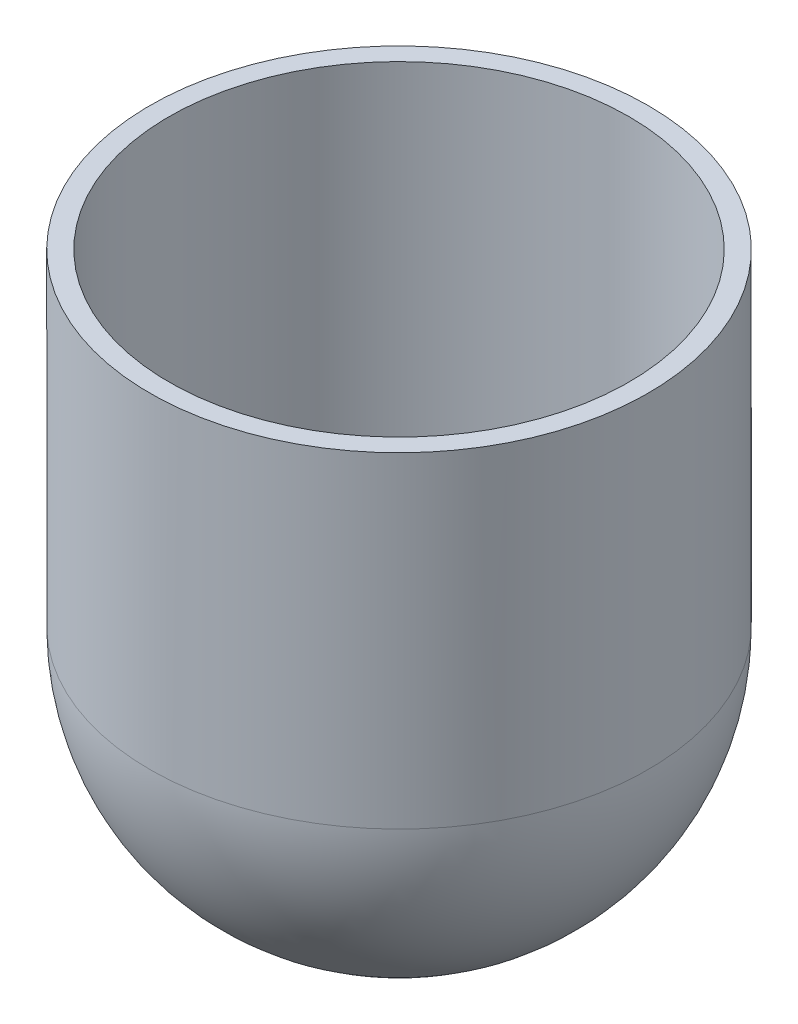
ISO-10303-21;
HEADER;
FILE_DESCRIPTION(('STEP AP214'),'2;1');
FILE_NAME('part.step','',(''),(''),'','','');
FILE_SCHEMA(('AUTOMOTIVE_DESIGN { 1 0 10303 214 1 1 1 1 }'));
ENDSEC;
DATA;
#1=APPLICATION_CONTEXT('core data for automotive mechanical design processes');
#2=APPLICATION_PROTOCOL_DEFINITION('international standard','automotive_design',2000,#1);
#3=PRODUCT_CONTEXT('',#1,'mechanical');
#4=PRODUCT('Part','Part','',(#3));
#5=PRODUCT_RELATED_PRODUCT_CATEGORY('part','',(#4));
#6=PRODUCT_DEFINITION_FORMATION('','',#4);
#7=PRODUCT_DEFINITION_CONTEXT('part definition',#1,'design');
#8=PRODUCT_DEFINITION('design','',#6,#7);
#9=PRODUCT_DEFINITION_SHAPE('','',#8);
#10=(LENGTH_UNIT() NAMED_UNIT(*) SI_UNIT(.MILLI.,.METRE.));
#11=(NAMED_UNIT(*) PLANE_ANGLE_UNIT() SI_UNIT($,.RADIAN.));
#12=(NAMED_UNIT(*) SI_UNIT($,.STERADIAN.) SOLID_ANGLE_UNIT());
#13=UNCERTAINTY_MEASURE_WITH_UNIT(LENGTH_MEASURE(1.E-05),#10,'distance_accuracy_value','');
#14=(GEOMETRIC_REPRESENTATION_CONTEXT(3) GLOBAL_UNCERTAINTY_ASSIGNED_CONTEXT((#13)) GLOBAL_UNIT_ASSIGNED_CONTEXT((#10,
#11,#12)) REPRESENTATION_CONTEXT('',''));
#15=CARTESIAN_POINT('',(0.,0.,0.));
#16=DIRECTION('',(0.,0.,1.));
#17=DIRECTION('',(1.,0.,0.));
#18=AXIS2_PLACEMENT_3D('',#15,#16,#17);
#19=CARTESIAN_POINT('',(0.,32.8043660714183,0.));
#20=DIRECTION('',(0.,-1.,0.));
#21=DIRECTION('',(0.,0.,-1.));
#22=AXIS2_PLACEMENT_3D('',#19,#20,#21);
#23=CYLINDRICAL_SURFACE('',#22,25.4);
#24=CARTESIAN_POINT('',(0.,32.8043660714183,0.));
#25=DIRECTION('',(0.,1.,0.));
#26=DIRECTION('',(0.,0.,1.));
#27=AXIS2_PLACEMENT_3D('',#24,#25,#26);
#28=CIRCLE('',#27,25.4);
#29=CARTESIAN_POINT('',(0.,32.8043660714183,-25.3999999999999));
#30=VERTEX_POINT('',#29);
#31=EDGE_CURVE('E10',#30,#30,#28,.T.);
#32=CARTESIAN_POINT('',(0.,-0.427916672864399,0.));
#33=DIRECTION('',(0.,1.,0.));
#34=DIRECTION('',(-0.391017014129058,0.,-0.920383449797744));
#35=AXIS2_PLACEMENT_3D('',#32,#33,#34);
#36=CIRCLE('',#35,25.4);
#37=CARTESIAN_POINT('',(0.,-0.427916672864577,-25.3999999999999));
#38=VERTEX_POINT('',#37);
#39=EDGE_CURVE('E45',#38,#38,#36,.T.);
#40=CARTESIAN_POINT('',(0.,32.8043660714183,-25.3999999999999));
#41=CARTESIAN_POINT('',(0.,32.4581964594987,-25.3999999999999));
#42=CARTESIAN_POINT('',(0.,32.1120268475791,-25.3999999999999));
#43=CARTESIAN_POINT('',(0.,31.4196876237399,-25.3999999999999));
#44=CARTESIAN_POINT('',(0.,31.0735180118203,-25.3999999999999));
#45=CARTESIAN_POINT('',(0.,30.381178787981,-25.3999999999999));
#46=CARTESIAN_POINT('',(0.,30.0350091760614,-25.3999999999999));
#47=CARTESIAN_POINT('',(0.,29.3426699522222,-25.3999999999999));
#48=CARTESIAN_POINT('',(0.,28.9965003403026,-25.3999999999999));
#49=CARTESIAN_POINT('',(0.,28.3041611164634,-25.3999999999999));
#50=CARTESIAN_POINT('',(0.,27.9579915045437,-25.3999999999999));
#51=CARTESIAN_POINT('',(0.,27.2656522807045,-25.3999999999999));
#52=CARTESIAN_POINT('',(0.,26.9194826687849,-25.3999999999999));
#53=CARTESIAN_POINT('',(0.,26.2271434449457,-25.3999999999999));
#54=CARTESIAN_POINT('',(0.,25.8809738330261,-25.3999999999999));
#55=CARTESIAN_POINT('',(0.,25.1886346091868,-25.3999999999999));
#56=CARTESIAN_POINT('',(0.,24.8424649972672,-25.3999999999999));
#57=CARTESIAN_POINT('',(0.,24.150125773428,-25.3999999999999));
#58=CARTESIAN_POINT('',(0.,23.8039561615084,-25.3999999999999));
#59=CARTESIAN_POINT('',(0.,23.1116169376692,-25.3999999999999));
#60=CARTESIAN_POINT('',(0.,22.7654473257495,-25.3999999999999));
#61=CARTESIAN_POINT('',(0.,22.0731081019103,-25.3999999999999));
#62=CARTESIAN_POINT('',(0.,21.7269384899907,-25.3999999999999));
#63=CARTESIAN_POINT('',(0.,21.0345992661515,-25.3999999999999));
#64=CARTESIAN_POINT('',(0.,20.6884296542319,-25.3999999999999));
#65=CARTESIAN_POINT('',(0.,19.9960904303926,-25.3999999999999));
#66=CARTESIAN_POINT('',(0.,19.649920818473,-25.3999999999999));
#67=CARTESIAN_POINT('',(0.,18.9575815946338,-25.3999999999999));
#68=CARTESIAN_POINT('',(0.,18.6114119827142,-25.3999999999999));
#69=CARTESIAN_POINT('',(0.,17.9190727588749,-25.3999999999999));
#70=CARTESIAN_POINT('',(0.,17.5729031469553,-25.3999999999999));
#71=CARTESIAN_POINT('',(0.,16.8805639231161,-25.3999999999999));
#72=CARTESIAN_POINT('',(0.,16.5343943111965,-25.3999999999999));
#73=CARTESIAN_POINT('',(0.,15.8420550873573,-25.3999999999999));
#74=CARTESIAN_POINT('',(0.,15.4958854754377,-25.3999999999999));
#75=CARTESIAN_POINT('',(0.,14.8035462515984,-25.3999999999999));
#76=CARTESIAN_POINT('',(0.,14.4573766396788,-25.3999999999999));
#77=CARTESIAN_POINT('',(0.,13.7650374158396,-25.3999999999999));
#78=CARTESIAN_POINT('',(0.,13.41886780392,-25.3999999999999));
#79=CARTESIAN_POINT('',(0.,12.7265285800807,-25.3999999999999));
#80=CARTESIAN_POINT('',(0.,12.3803589681611,-25.3999999999999));
#81=CARTESIAN_POINT('',(0.,11.6880197443219,-25.3999999999999));
#82=CARTESIAN_POINT('',(0.,11.3418501324023,-25.3999999999999));
#83=CARTESIAN_POINT('',(0.,10.6495109085631,-25.3999999999999));
#84=CARTESIAN_POINT('',(0.,10.3033412966434,-25.3999999999999));
#85=CARTESIAN_POINT('',(0.,9.61100207280422,-25.3999999999999));
#86=CARTESIAN_POINT('',(0.,9.2648324608846,-25.3999999999999));
#87=CARTESIAN_POINT('',(0.,8.57249323704538,-25.3999999999999));
#88=CARTESIAN_POINT('',(0.,8.22632362512576,-25.3999999999999));
#89=CARTESIAN_POINT('',(0.,7.53398440128653,-25.3999999999999));
#90=CARTESIAN_POINT('',(0.,7.18781478936692,-25.3999999999999));
#91=CARTESIAN_POINT('',(0.,6.49547556552769,-25.3999999999999));
#92=CARTESIAN_POINT('',(0.,6.14930595360808,-25.3999999999999));
#93=CARTESIAN_POINT('',(0.,5.45696672976885,-25.3999999999999));
#94=CARTESIAN_POINT('',(0.,5.11079711784924,-25.3999999999999));
#95=CARTESIAN_POINT('',(0.,4.41845789401001,-25.3999999999999));
#96=CARTESIAN_POINT('',(0.,4.0722882820904,-25.3999999999999));
#97=CARTESIAN_POINT('',(0.,3.37994905825117,-25.3999999999999));
#98=CARTESIAN_POINT('',(0.,3.03377944633155,-25.3999999999999));
#99=CARTESIAN_POINT('',(0.,2.34144022249233,-25.3999999999999));
#100=CARTESIAN_POINT('',(0.,1.99527061057271,-25.3999999999999));
#101=CARTESIAN_POINT('',(0.,1.30293138673349,-25.3999999999999));
#102=CARTESIAN_POINT('',(0.,0.956761774813878,-25.3999999999999));
#103=CARTESIAN_POINT('',(0.,0.264422550974653,-25.3999999999999));
#104=CARTESIAN_POINT('',(0.,-0.0817470609449625,-25.3999999999999));
#105=CARTESIAN_POINT('',(0.,-0.427916672864577,-25.3999999999999));
#106=B_SPLINE_CURVE_WITH_KNOTS('',3,(#40,#41,#42,#43,#44,#45,#46,#47,#48,#49,#50,#51,#52,#53,
#54,#55,#56,#57,#58,#59,#60,#61,#62,#63,#64,#65,#66,#67,#68,#69,#70,#71,#72,#73,#74,#75,#76,#77,
#78,#79,#80,#81,#82,#83,#84,#85,#86,#87,#88,#89,#90,#91,#92,#93,#94,#95,#96,#97,#98,#99,#100,
#101,#102,#103,#104,#105),.UNSPECIFIED.,.F.,.F.,(4,2,2,2,2,2,2,2,2,2,2,2,2,2,2,2,2,2,2,2,2,2,2,
2,2,2,2,2,2,2,2,2,4),(0.,1.03850883575884,2.07701767151769,3.11552650727653,4.15403534303537,
5.19254417879421,6.23105301455305,7.26956185031189,8.30807068607074,9.34657952182957,
10.3850883575884,11.4235971933473,12.4621060291061,13.5006148648649,14.5391237006238,
15.5776325363826,16.6161413721415,17.6546502079003,18.6931590436591,19.731667879418,
20.7701767151768,21.8086855509357,22.8471943866945,23.8857032224534,24.9242120582122,
25.962720893971,27.0012297297299,28.0397385654887,29.0782474012476,30.1167562370064,
31.1552650727652,32.1937739085241,33.2322827442829),.UNSPECIFIED.);
#107=EDGE_CURVE('BSEAM35',#30,#38,#106,.T.);
#108=ORIENTED_EDGE('',*,*,#31,.F.);
#109=ORIENTED_EDGE('',*,*,#39,.T.);
#110=ORIENTED_EDGE('',*,*,#107,.T.);
#111=ORIENTED_EDGE('',*,*,#107,.F.);
#112=EDGE_LOOP('',(#108,#110,#109,#111));
#113=FACE_BOUND('',#112,.T.);
#114=ADVANCED_FACE('F35',(#113),#23,.T.);
#115=CARTESIAN_POINT('',(0.,32.8043660714183,0.));
#116=DIRECTION('',(0.,1.,0.));
#117=DIRECTION('',(0.,0.,1.));
#118=AXIS2_PLACEMENT_3D('',#115,#116,#117);
#119=PLANE('',#118);
#120=CARTESIAN_POINT('',(0.,32.8043660714183,0.));
#121=DIRECTION('',(0.,1.,0.));
#122=DIRECTION('',(0.,0.,1.));
#123=AXIS2_PLACEMENT_3D('',#120,#121,#122);
#124=CIRCLE('',#123,23.4461538461538);
#125=CARTESIAN_POINT('',(0.,32.8043660714183,-23.4461538461538));
#126=VERTEX_POINT('',#125);
#127=EDGE_CURVE('E41',#126,#126,#124,.T.);
#128=ORIENTED_EDGE('',*,*,#127,.F.);
#129=EDGE_LOOP('',(#128));
#130=FACE_BOUND('',#129,.T.);
#131=ORIENTED_EDGE('',*,*,#31,.T.);
#132=EDGE_LOOP('',(#131));
#133=FACE_BOUND('',#132,.T.);
#134=ADVANCED_FACE('F60',(#130,#133),#119,.T.);
#135=CARTESIAN_POINT('',(0.,32.8043660714183,0.));
#136=DIRECTION('',(0.,-1.,0.));
#137=DIRECTION('',(0.,0.,-1.));
#138=AXIS2_PLACEMENT_3D('',#135,#136,#137);
#139=CYLINDRICAL_SURFACE('',#138,23.4461538461538);
#140=CARTESIAN_POINT('',(0.,-0.427916672864564,0.));
#141=DIRECTION('',(0.,-1.,0.));
#142=DIRECTION('',(0.,0.,-1.));
#143=AXIS2_PLACEMENT_3D('',#140,#141,#142);
#144=CIRCLE('',#143,23.4461538461538);
#145=CARTESIAN_POINT('',(0.,-0.427916672864563,-23.4461538461538));
#146=VERTEX_POINT('',#145);
#147=EDGE_CURVE('E49',#146,#146,#144,.F.);
#148=CARTESIAN_POINT('',(0.,32.8043660714183,-23.4461538461538));
#149=CARTESIAN_POINT('',(0.,32.4581964594987,-23.4461538461538));
#150=CARTESIAN_POINT('',(0.,32.1120268475791,-23.4461538461538));
#151=CARTESIAN_POINT('',(0.,31.4196876237399,-23.4461538461538));
#152=CARTESIAN_POINT('',(0.,31.0735180118203,-23.4461538461538));
#153=CARTESIAN_POINT('',(0.,30.381178787981,-23.4461538461538));
#154=CARTESIAN_POINT('',(0.,30.0350091760614,-23.4461538461538));
#155=CARTESIAN_POINT('',(0.,29.3426699522222,-23.4461538461538));
#156=CARTESIAN_POINT('',(0.,28.9965003403026,-23.4461538461538));
#157=CARTESIAN_POINT('',(0.,28.3041611164634,-23.4461538461538));
#158=CARTESIAN_POINT('',(0.,27.9579915045438,-23.4461538461538));
#159=CARTESIAN_POINT('',(0.,27.2656522807045,-23.4461538461538));
#160=CARTESIAN_POINT('',(0.,26.9194826687849,-23.4461538461538));
#161=CARTESIAN_POINT('',(0.,26.2271434449457,-23.4461538461538));
#162=CARTESIAN_POINT('',(0.,25.8809738330261,-23.4461538461538));
#163=CARTESIAN_POINT('',(0.,25.1886346091868,-23.4461538461538));
#164=CARTESIAN_POINT('',(0.,24.8424649972672,-23.4461538461538));
#165=CARTESIAN_POINT('',(0.,24.150125773428,-23.4461538461538));
#166=CARTESIAN_POINT('',(0.,23.8039561615084,-23.4461538461538));
#167=CARTESIAN_POINT('',(0.,23.1116169376692,-23.4461538461538));
#168=CARTESIAN_POINT('',(0.,22.7654473257495,-23.4461538461538));
#169=CARTESIAN_POINT('',(0.,22.0731081019103,-23.4461538461538));
#170=CARTESIAN_POINT('',(0.,21.7269384899907,-23.4461538461538));
#171=CARTESIAN_POINT('',(0.,21.0345992661515,-23.4461538461538));
#172=CARTESIAN_POINT('',(0.,20.6884296542319,-23.4461538461538));
#173=CARTESIAN_POINT('',(0.,19.9960904303926,-23.4461538461538));
#174=CARTESIAN_POINT('',(0.,19.649920818473,-23.4461538461538));
#175=CARTESIAN_POINT('',(0.,18.9575815946338,-23.4461538461538));
#176=CARTESIAN_POINT('',(0.,18.6114119827142,-23.4461538461538));
#177=CARTESIAN_POINT('',(0.,17.919072758875,-23.4461538461538));
#178=CARTESIAN_POINT('',(0.,17.5729031469553,-23.4461538461538));
#179=CARTESIAN_POINT('',(0.,16.8805639231161,-23.4461538461538));
#180=CARTESIAN_POINT('',(0.,16.5343943111965,-23.4461538461538));
#181=CARTESIAN_POINT('',(0.,15.8420550873573,-23.4461538461538));
#182=CARTESIAN_POINT('',(0.,15.4958854754377,-23.4461538461538));
#183=CARTESIAN_POINT('',(0.,14.8035462515984,-23.4461538461538));
#184=CARTESIAN_POINT('',(0.,14.4573766396788,-23.4461538461538));
#185=CARTESIAN_POINT('',(0.,13.7650374158396,-23.4461538461538));
#186=CARTESIAN_POINT('',(0.,13.41886780392,-23.4461538461538));
#187=CARTESIAN_POINT('',(0.,12.7265285800808,-23.4461538461538));
#188=CARTESIAN_POINT('',(0.,12.3803589681611,-23.4461538461538));
#189=CARTESIAN_POINT('',(0.,11.6880197443219,-23.4461538461538));
#190=CARTESIAN_POINT('',(0.,11.3418501324023,-23.4461538461538));
#191=CARTESIAN_POINT('',(0.,10.6495109085631,-23.4461538461538));
#192=CARTESIAN_POINT('',(0.,10.3033412966435,-23.4461538461538));
#193=CARTESIAN_POINT('',(0.,9.61100207280423,-23.4461538461538));
#194=CARTESIAN_POINT('',(0.,9.26483246088462,-23.4461538461538));
#195=CARTESIAN_POINT('',(0.,8.57249323704539,-23.4461538461538));
#196=CARTESIAN_POINT('',(0.,8.22632362512578,-23.4461538461538));
#197=CARTESIAN_POINT('',(0.,7.53398440128655,-23.4461538461538));
#198=CARTESIAN_POINT('',(0.,7.18781478936694,-23.4461538461538));
#199=CARTESIAN_POINT('',(0.,6.49547556552771,-23.4461538461538));
#200=CARTESIAN_POINT('',(0.,6.1493059536081,-23.4461538461538));
#201=CARTESIAN_POINT('',(0.,5.45696672976887,-23.4461538461538));
#202=CARTESIAN_POINT('',(0.,5.11079711784926,-23.4461538461538));
#203=CARTESIAN_POINT('',(0.,4.41845789401003,-23.4461538461538));
#204=CARTESIAN_POINT('',(0.,4.07228828209041,-23.4461538461538));
#205=CARTESIAN_POINT('',(0.,3.37994905825119,-23.4461538461538));
#206=CARTESIAN_POINT('',(0.,3.03377944633157,-23.4461538461538));
#207=CARTESIAN_POINT('',(0.,2.34144022249235,-23.4461538461538));
#208=CARTESIAN_POINT('',(0.,1.99527061057273,-23.4461538461538));
#209=CARTESIAN_POINT('',(0.,1.3029313867335,-23.4461538461538));
#210=CARTESIAN_POINT('',(0.,0.956761774813889,-23.4461538461538));
#211=CARTESIAN_POINT('',(0.,0.264422550974662,-23.4461538461538));
#212=CARTESIAN_POINT('',(0.,-0.0817470609449505,-23.4461538461538));
#213=CARTESIAN_POINT('',(0.,-0.427916672864563,-23.4461538461538));
#214=B_SPLINE_CURVE_WITH_KNOTS('',3,(#148,#149,#150,#151,#152,#153,#154,#155,#156,#157,#158,
#159,#160,#161,#162,#163,#164,#165,#166,#167,#168,#169,#170,#171,#172,#173,#174,#175,#176,#177,
#178,#179,#180,#181,#182,#183,#184,#185,#186,#187,#188,#189,#190,#191,#192,#193,#194,#195,#196,
#197,#198,#199,#200,#201,#202,#203,#204,#205,#206,#207,#208,#209,#210,#211,#212,#213),
.UNSPECIFIED.,.F.,.F.,(4,2,2,2,2,2,2,2,2,2,2,2,2,2,2,2,2,2,2,2,2,2,2,2,2,2,2,2,2,2,2,2,4),(0.,
1.03850883575884,2.07701767151768,3.11552650727652,4.15403534303536,5.1925441787942,
6.23105301455304,7.26956185031188,8.30807068607072,9.34657952182956,10.3850883575884,
11.4235971933472,12.4621060291061,13.5006148648649,14.5391237006238,15.5776325363826,
16.6161413721414,17.6546502079003,18.6931590436591,19.731667879418,20.7701767151768,
21.8086855509357,22.8471943866945,23.8857032224533,24.9242120582122,25.962720893971,
27.0012297297299,28.0397385654887,29.0782474012475,30.1167562370064,31.1552650727652,
32.1937739085241,33.2322827442829),.UNSPECIFIED.);
#215=EDGE_CURVE('BSEAM57',#126,#146,#214,.T.);
#216=ORIENTED_EDGE('',*,*,#127,.T.);
#217=ORIENTED_EDGE('',*,*,#147,.F.);
#218=ORIENTED_EDGE('',*,*,#215,.T.);
#219=ORIENTED_EDGE('',*,*,#215,.F.);
#220=EDGE_LOOP('',(#216,#218,#217,#219));
#221=FACE_BOUND('',#220,.T.);
#222=ADVANCED_FACE('F57',(#221),#139,.F.);
#223=CARTESIAN_POINT('',(0.,-0.427916672864399,0.));
#224=DIRECTION('',(0.979893731431563,0.,-0.199520112021641));
#225=DIRECTION('',(-0.199520112021641,0.,-0.979893731431563));
#226=AXIS2_PLACEMENT_3D('',#223,#224,#225);
#227=SPHERICAL_SURFACE('',#226,25.4);
#228=CARTESIAN_POINT('',(0.,-0.427916672864399,0.));
#229=DIRECTION('',(0.,1.,0.));
#230=DIRECTION('',(-0.391017014129058,0.,-0.920383449797744));
#231=AXIS2_PLACEMENT_3D('',#228,#229,#230);
#232=SPHERICAL_SURFACE('',#231,25.4);
#233=ORIENTED_EDGE('',*,*,#39,.F.);
#234=EDGE_LOOP('',(#233));
#235=FACE_BOUND('',#234,.T.);
#236=ADVANCED_FACE('F59',(#235),#232,.T.);
#237=CARTESIAN_POINT('',(0.,-0.427916672864399,0.));
#238=DIRECTION('',(0.979893731431563,0.,-0.199520112021641));
#239=DIRECTION('',(-0.199520112021641,0.,-0.979893731431563));
#240=AXIS2_PLACEMENT_3D('',#237,#238,#239);
#241=SPHERICAL_SURFACE('',#240,23.4461538461538);
#242=CARTESIAN_POINT('',(0.,-0.427916672864399,0.));
#243=DIRECTION('',(0.,-1.,0.));
#244=DIRECTION('',(0.,0.,-1.));
#245=AXIS2_PLACEMENT_3D('',#242,#243,#244);
#246=SPHERICAL_SURFACE('',#245,23.4461538461538);
#247=ORIENTED_EDGE('',*,*,#147,.T.);
#248=EDGE_LOOP('',(#247));
#249=FACE_BOUND('',#248,.T.);
#250=ADVANCED_FACE('F55',(#249),#246,.F.);
#251=CLOSED_SHELL('',(#114,#134,#222,#236,#250));
#252=MANIFOLD_SOLID_BREP('B2',#251);
#253=ADVANCED_BREP_SHAPE_REPRESENTATION('',(#18,#252),#14);
#254=SHAPE_DEFINITION_REPRESENTATION(#9,#253);
ENDSEC;
END-ISO-10303-21;
